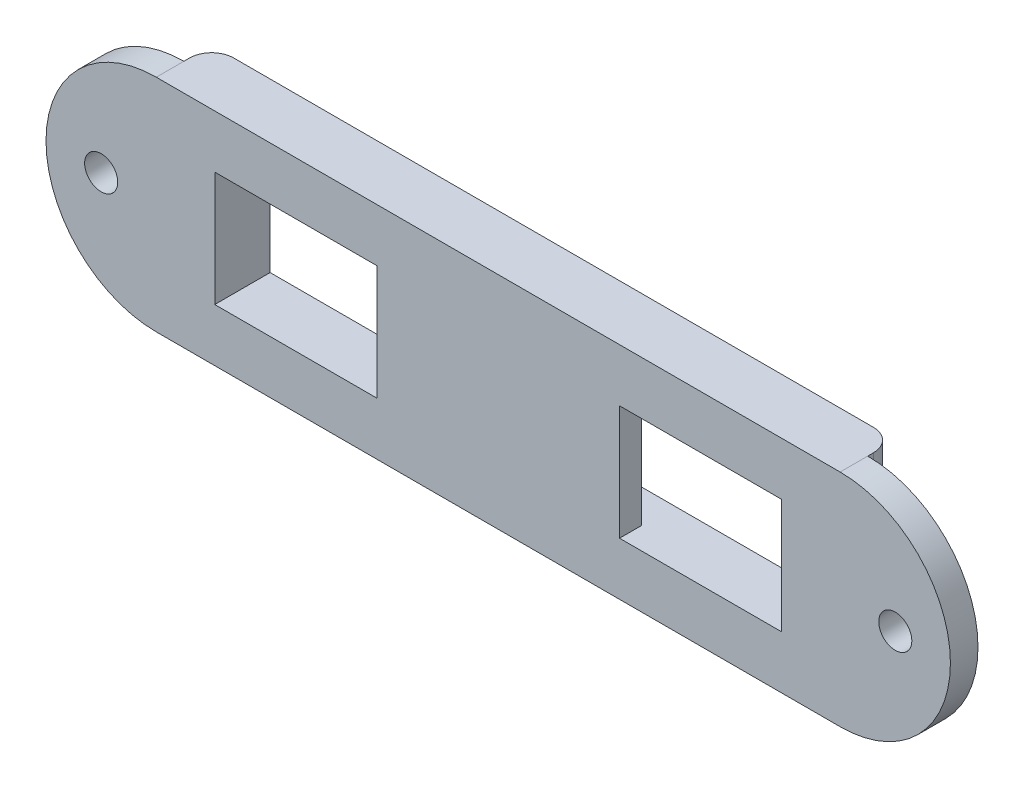
ISO-10303-21;
HEADER;
FILE_DESCRIPTION(('STEP AP214'),'2;1');
FILE_NAME('part.step','',(''),(''),'','','');
FILE_SCHEMA(('AUTOMOTIVE_DESIGN { 1 0 10303 214 1 1 1 1 }'));
ENDSEC;
DATA;
#1=APPLICATION_CONTEXT('core data for automotive mechanical design processes');
#2=APPLICATION_PROTOCOL_DEFINITION('international standard','automotive_design',2000,#1);
#3=PRODUCT_CONTEXT('',#1,'mechanical');
#4=PRODUCT('Part','Part','',(#3));
#5=PRODUCT_RELATED_PRODUCT_CATEGORY('part','',(#4));
#6=PRODUCT_DEFINITION_FORMATION('','',#4);
#7=PRODUCT_DEFINITION_CONTEXT('part definition',#1,'design');
#8=PRODUCT_DEFINITION('design','',#6,#7);
#9=PRODUCT_DEFINITION_SHAPE('','',#8);
#10=(LENGTH_UNIT() NAMED_UNIT(*) SI_UNIT(.MILLI.,.METRE.));
#11=(NAMED_UNIT(*) PLANE_ANGLE_UNIT() SI_UNIT($,.RADIAN.));
#12=(NAMED_UNIT(*) SI_UNIT($,.STERADIAN.) SOLID_ANGLE_UNIT());
#13=UNCERTAINTY_MEASURE_WITH_UNIT(LENGTH_MEASURE(1.E-05),#10,'distance_accuracy_value','');
#14=(GEOMETRIC_REPRESENTATION_CONTEXT(3) GLOBAL_UNCERTAINTY_ASSIGNED_CONTEXT((#13)) GLOBAL_UNIT_ASSIGNED_CONTEXT((#10,
#11,#12)) REPRESENTATION_CONTEXT('',''));
#15=CARTESIAN_POINT('',(0.,0.,0.));
#16=DIRECTION('',(0.,0.,1.));
#17=DIRECTION('',(1.,0.,0.));
#18=AXIS2_PLACEMENT_3D('',#15,#16,#17);
#19=CARTESIAN_POINT('',(-8.5362512379608,0.,3.02));
#20=DIRECTION('',(-1.,0.,0.));
#21=DIRECTION('',(0.,-1.,0.));
#22=AXIS2_PLACEMENT_3D('',#19,#20,#21);
#23=PLANE('',#22);
#24=DIRECTION('',(0.,0.,-1.));
#25=VECTOR('',#24,1.);
#26=CARTESIAN_POINT('',(-8.53625123796101,53.8950418755802,3.02));
#27=LINE('',#26,#25);
#28=CARTESIAN_POINT('',(-8.53625123796101,53.8950418755802,2.52));
#29=VERTEX_POINT('',#28);
#30=CARTESIAN_POINT('',(-8.53625123796101,53.8950418755802,2.));
#31=VERTEX_POINT('',#30);
#32=EDGE_CURVE('E143',#29,#31,#27,.T.);
#33=ORIENTED_EDGE('',*,*,#32,.T.);
#34=DIRECTION('',(0.,1.,0.));
#35=VECTOR('',#34,1.);
#36=CARTESIAN_POINT('',(-8.53625123796093,33.8950418755802,2.));
#37=LINE('',#36,#35);
#38=CARTESIAN_POINT('',(-8.53625123796093,33.8950418755802,2.));
#39=VERTEX_POINT('',#38);
#40=EDGE_CURVE('E42',#31,#39,#37,.F.);
#41=ORIENTED_EDGE('',*,*,#40,.T.);
#42=DIRECTION('',(0.,0.,-1.));
#43=VECTOR('',#42,1.);
#44=CARTESIAN_POINT('',(-8.53625123796093,33.8950418755802,3.02));
#45=LINE('',#44,#43);
#46=CARTESIAN_POINT('',(-8.53625123796093,33.8950418755802,2.52));
#47=VERTEX_POINT('',#46);
#48=EDGE_CURVE('E155',#47,#39,#45,.T.);
#49=ORIENTED_EDGE('',*,*,#48,.F.);
#50=DIRECTION('',(0.,-1.,0.));
#51=VECTOR('',#50,1.);
#52=CARTESIAN_POINT('',(-8.5362512379608,0.,2.52));
#53=LINE('',#52,#51);
#54=EDGE_CURVE('E153',#29,#47,#53,.T.);
#55=ORIENTED_EDGE('',*,*,#54,.F.);
#56=EDGE_LOOP('',(#33,#41,#49,#55));
#57=FACE_BOUND('',#56,.T.);
#58=ADVANCED_FACE('F34',(#57),#23,.T.);
#59=CARTESIAN_POINT('',(53.4637487620388,-1.85489640182469E-13,3.02));
#60=DIRECTION('',(1.,0.,0.));
#61=DIRECTION('',(0.,1.,0.));
#62=AXIS2_PLACEMENT_3D('',#59,#60,#61);
#63=PLANE('',#62);
#64=DIRECTION('',(0.,0.,-1.));
#65=VECTOR('',#64,1.);
#66=CARTESIAN_POINT('',(53.4637487620389,33.8950418755802,3.02));
#67=LINE('',#66,#65);
#68=CARTESIAN_POINT('',(53.4637487620389,33.8950418755802,2.52));
#69=VERTEX_POINT('',#68);
#70=CARTESIAN_POINT('',(53.4637487620389,33.8950418755802,2.));
#71=VERTEX_POINT('',#70);
#72=EDGE_CURVE('E351',#69,#71,#67,.T.);
#73=ORIENTED_EDGE('',*,*,#72,.T.);
#74=DIRECTION('',(0.,-1.,0.));
#75=VECTOR('',#74,1.);
#76=CARTESIAN_POINT('',(53.463748762039,53.8950418755802,2.));
#77=LINE('',#76,#75);
#78=CARTESIAN_POINT('',(53.463748762039,53.8950418755802,2.));
#79=VERTEX_POINT('',#78);
#80=EDGE_CURVE('E219',#71,#79,#77,.F.);
#81=ORIENTED_EDGE('',*,*,#80,.T.);
#82=DIRECTION('',(0.,0.,-1.));
#83=VECTOR('',#82,1.);
#84=CARTESIAN_POINT('',(53.463748762039,53.8950418755802,3.02));
#85=LINE('',#84,#83);
#86=CARTESIAN_POINT('',(53.463748762039,53.8950418755802,2.52));
#87=VERTEX_POINT('',#86);
#88=EDGE_CURVE('E239',#87,#79,#85,.T.);
#89=ORIENTED_EDGE('',*,*,#88,.F.);
#90=DIRECTION('',(0.,1.,0.));
#91=VECTOR('',#90,1.);
#92=CARTESIAN_POINT('',(53.4637487620388,-1.85489640182469E-13,2.52));
#93=LINE('',#92,#91);
#94=EDGE_CURVE('E316',#69,#87,#93,.T.);
#95=ORIENTED_EDGE('',*,*,#94,.F.);
#96=EDGE_LOOP('',(#73,#81,#89,#95));
#97=FACE_BOUND('',#96,.T.);
#98=ADVANCED_FACE('F253',(#97),#63,.T.);
#99=CARTESIAN_POINT('',(0.,49.0950418755802,3.02));
#100=DIRECTION('',(0.,1.,0.));
#101=DIRECTION('',(0.,0.,1.));
#102=AXIS2_PLACEMENT_3D('',#99,#100,#101);
#103=PLANE('',#102);
#104=DIRECTION('',(0.,0.,1.));
#105=VECTOR('',#104,1.);
#106=CARTESIAN_POINT('',(33.463748762039,49.0950418755802,3.02));
#107=LINE('',#106,#105);
#108=CARTESIAN_POINT('',(33.463748762039,49.0950418755802,3.02));
#109=VERTEX_POINT('',#108);
#110=CARTESIAN_POINT('',(33.463748762039,49.0950418755802,5.02));
#111=VERTEX_POINT('',#110);
#112=EDGE_CURVE('E213',#109,#111,#107,.T.);
#113=ORIENTED_EDGE('',*,*,#112,.F.);
#114=DIRECTION('',(1.,0.,0.));
#115=VECTOR('',#114,1.);
#116=CARTESIAN_POINT('',(0.,49.0950418755802,3.02));
#117=LINE('',#116,#115);
#118=CARTESIAN_POINT('',(11.463748762039,49.0950418755802,3.02));
#119=VERTEX_POINT('',#118);
#120=EDGE_CURVE('E334',#119,#109,#117,.T.);
#121=ORIENTED_EDGE('',*,*,#120,.F.);
#122=DIRECTION('',(0.,0.,1.));
#123=VECTOR('',#122,1.);
#124=CARTESIAN_POINT('',(11.463748762039,49.0950418755802,3.02));
#125=LINE('',#124,#123);
#126=CARTESIAN_POINT('',(11.463748762039,49.0950418755802,5.02));
#127=VERTEX_POINT('',#126);
#128=EDGE_CURVE('E339',#119,#127,#125,.T.);
#129=ORIENTED_EDGE('',*,*,#128,.T.);
#130=DIRECTION('',(1.,0.,0.));
#131=VECTOR('',#130,1.);
#132=CARTESIAN_POINT('',(0.,49.0950418755802,5.02));
#133=LINE('',#132,#131);
#134=CARTESIAN_POINT('',(-3.23625123796101,49.0950418755802,5.02));
#135=VERTEX_POINT('',#134);
#136=EDGE_CURVE('E201',#135,#127,#133,.T.);
#137=ORIENTED_EDGE('',*,*,#136,.F.);
#138=DIRECTION('',(0.,0.,-1.));
#139=VECTOR('',#138,1.);
#140=CARTESIAN_POINT('',(-3.23625123796101,49.0950418755802,3.02));
#141=LINE('',#140,#139);
#142=CARTESIAN_POINT('',(-3.23625123796101,49.0950418755802,0.));
#143=VERTEX_POINT('',#142);
#144=EDGE_CURVE('E177',#135,#143,#141,.T.);
#145=ORIENTED_EDGE('',*,*,#144,.T.);
#146=DIRECTION('',(1.,0.,0.));
#147=VECTOR('',#146,1.);
#148=CARTESIAN_POINT('',(0.,49.0950418755802,0.));
#149=LINE('',#148,#147);
#150=CARTESIAN_POINT('',(48.163748762039,49.0950418755802,0.));
#151=VERTEX_POINT('',#150);
#152=EDGE_CURVE('E180',#143,#151,#149,.T.);
#153=ORIENTED_EDGE('',*,*,#152,.T.);
#154=DIRECTION('',(0.,0.,-1.));
#155=VECTOR('',#154,1.);
#156=CARTESIAN_POINT('',(48.163748762039,49.0950418755802,3.02));
#157=LINE('',#156,#155);
#158=CARTESIAN_POINT('',(48.163748762039,49.0950418755802,5.02));
#159=VERTEX_POINT('',#158);
#160=EDGE_CURVE('E150',#159,#151,#157,.T.);
#161=ORIENTED_EDGE('',*,*,#160,.F.);
#162=EDGE_CURVE('E210',#111,#159,#133,.T.);
#163=ORIENTED_EDGE('',*,*,#162,.F.);
#164=EDGE_LOOP('',(#113,#121,#129,#137,#145,#153,#161,#163));
#165=FACE_BOUND('',#164,.T.);
#166=ADVANCED_FACE('F258',(#165),#103,.F.);
#167=CARTESIAN_POINT('',(0.,38.6950418755802,3.02));
#168=DIRECTION('',(0.,-1.,0.));
#169=DIRECTION('',(0.,0.,-1.));
#170=AXIS2_PLACEMENT_3D('',#167,#168,#169);
#171=PLANE('',#170);
#172=DIRECTION('',(0.,0.,-1.));
#173=VECTOR('',#172,1.);
#174=CARTESIAN_POINT('',(33.463748762039,38.6950418755802,3.02));
#175=LINE('',#174,#173);
#176=CARTESIAN_POINT('',(33.463748762039,38.6950418755802,5.02));
#177=VERTEX_POINT('',#176);
#178=CARTESIAN_POINT('',(33.463748762039,38.6950418755802,3.02));
#179=VERTEX_POINT('',#178);
#180=EDGE_CURVE('E342',#177,#179,#175,.T.);
#181=ORIENTED_EDGE('',*,*,#180,.F.);
#182=DIRECTION('',(1.,0.,0.));
#183=VECTOR('',#182,1.);
#184=CARTESIAN_POINT('',(0.,38.6950418755802,5.02));
#185=LINE('',#184,#183);
#186=CARTESIAN_POINT('',(48.163748762039,38.6950418755802,5.02));
#187=VERTEX_POINT('',#186);
#188=EDGE_CURVE('E294',#177,#187,#185,.T.);
#189=ORIENTED_EDGE('',*,*,#188,.T.);
#190=DIRECTION('',(0.,0.,-1.));
#191=VECTOR('',#190,1.);
#192=CARTESIAN_POINT('',(48.163748762039,38.6950418755802,3.02));
#193=LINE('',#192,#191);
#194=CARTESIAN_POINT('',(48.163748762039,38.6950418755802,0.));
#195=VERTEX_POINT('',#194);
#196=EDGE_CURVE('E185',#187,#195,#193,.T.);
#197=ORIENTED_EDGE('',*,*,#196,.T.);
#198=DIRECTION('',(-1.,0.,0.));
#199=VECTOR('',#198,1.);
#200=CARTESIAN_POINT('',(0.,38.6950418755802,0.));
#201=LINE('',#200,#199);
#202=CARTESIAN_POINT('',(-3.23625123796101,38.6950418755802,0.));
#203=VERTEX_POINT('',#202);
#204=EDGE_CURVE('E188',#195,#203,#201,.T.);
#205=ORIENTED_EDGE('',*,*,#204,.T.);
#206=DIRECTION('',(0.,0.,-1.));
#207=VECTOR('',#206,1.);
#208=CARTESIAN_POINT('',(-3.23625123796101,38.6950418755802,3.02));
#209=LINE('',#208,#207);
#210=CARTESIAN_POINT('',(-3.23625123796101,38.6950418755802,5.02));
#211=VERTEX_POINT('',#210);
#212=EDGE_CURVE('E181',#211,#203,#209,.T.);
#213=ORIENTED_EDGE('',*,*,#212,.F.);
#214=CARTESIAN_POINT('',(11.463748762039,38.6950418755802,5.02));
#215=VERTEX_POINT('',#214);
#216=EDGE_CURVE('E189',#211,#215,#185,.T.);
#217=ORIENTED_EDGE('',*,*,#216,.T.);
#218=DIRECTION('',(0.,0.,-1.));
#219=VECTOR('',#218,1.);
#220=CARTESIAN_POINT('',(11.463748762039,38.6950418755802,3.02));
#221=LINE('',#220,#219);
#222=CARTESIAN_POINT('',(11.463748762039,38.6950418755802,3.02));
#223=VERTEX_POINT('',#222);
#224=EDGE_CURVE('E336',#215,#223,#221,.T.);
#225=ORIENTED_EDGE('',*,*,#224,.T.);
#226=DIRECTION('',(-1.,0.,0.));
#227=VECTOR('',#226,1.);
#228=CARTESIAN_POINT('',(0.,38.6950418755802,3.02));
#229=LINE('',#228,#227);
#230=EDGE_CURVE('E329',#179,#223,#229,.T.);
#231=ORIENTED_EDGE('',*,*,#230,.F.);
#232=EDGE_LOOP('',(#181,#189,#197,#205,#213,#217,#225,#231));
#233=FACE_BOUND('',#232,.T.);
#234=ADVANCED_FACE('F277',(#233),#171,.F.);
#235=CARTESIAN_POINT('',(0.,0.,5.02));
#236=DIRECTION('',(0.,0.,1.));
#237=DIRECTION('',(1.,0.,0.));
#238=AXIS2_PLACEMENT_3D('',#235,#236,#237);
#239=PLANE('',#238);
#240=ORIENTED_EDGE('',*,*,#188,.F.);
#241=DIRECTION('',(0.,-1.,0.));
#242=VECTOR('',#241,1.);
#243=CARTESIAN_POINT('',(33.463748762039,0.,5.02));
#244=LINE('',#243,#242);
#245=EDGE_CURVE('E322',#111,#177,#244,.T.);
#246=ORIENTED_EDGE('',*,*,#245,.F.);
#247=ORIENTED_EDGE('',*,*,#162,.T.);
#248=DIRECTION('',(0.,1.,0.));
#249=VECTOR('',#248,1.);
#250=CARTESIAN_POINT('',(48.163748762039,0.,5.02));
#251=LINE('',#250,#249);
#252=EDGE_CURVE('E184',#187,#159,#251,.T.);
#253=ORIENTED_EDGE('',*,*,#252,.F.);
#254=EDGE_LOOP('',(#240,#246,#247,#253));
#255=FACE_BOUND('',#254,.T.);
#256=DIRECTION('',(0.,-1.,0.));
#257=VECTOR('',#256,1.);
#258=CARTESIAN_POINT('',(11.463748762039,0.,5.02));
#259=LINE('',#258,#257);
#260=EDGE_CURVE('E298',#127,#215,#259,.T.);
#261=ORIENTED_EDGE('',*,*,#260,.T.);
#262=ORIENTED_EDGE('',*,*,#216,.F.);
#263=DIRECTION('',(0.,-1.,0.));
#264=VECTOR('',#263,1.);
#265=CARTESIAN_POINT('',(-3.236251237961,0.,5.02));
#266=LINE('',#265,#264);
#267=EDGE_CURVE('E192',#135,#211,#266,.T.);
#268=ORIENTED_EDGE('',*,*,#267,.F.);
#269=ORIENTED_EDGE('',*,*,#136,.T.);
#270=EDGE_LOOP('',(#261,#262,#268,#269));
#271=FACE_BOUND('',#270,.T.);
#272=DIRECTION('',(-1.,0.,0.));
#273=VECTOR('',#272,1.);
#274=CARTESIAN_POINT('',(53.463748762039,53.8950418755802,5.02));
#275=LINE('',#274,#273);
#276=CARTESIAN_POINT('',(53.463748762039,53.8950418755802,5.02));
#277=VERTEX_POINT('',#276);
#278=CARTESIAN_POINT('',(-8.53625123796101,53.8950418755802,5.02));
#279=VERTEX_POINT('',#278);
#280=EDGE_CURVE('E211',#277,#279,#275,.T.);
#281=ORIENTED_EDGE('',*,*,#280,.T.);
#282=CARTESIAN_POINT('',(-8.53625123796097,43.8950418755802,5.02));
#283=DIRECTION('',(0.,0.,1.));
#284=DIRECTION('',(1.,0.,0.));
#285=AXIS2_PLACEMENT_3D('',#282,#283,#284);
#286=CIRCLE('',#285,10.);
#287=CARTESIAN_POINT('',(-8.53625123796093,33.8950418755802,5.02));
#288=VERTEX_POINT('',#287);
#289=EDGE_CURVE('E170',#288,#279,#286,.F.);
#290=ORIENTED_EDGE('',*,*,#289,.F.);
#291=DIRECTION('',(1.,0.,0.));
#292=VECTOR('',#291,1.);
#293=CARTESIAN_POINT('',(-8.53625123796093,33.8950418755802,5.02));
#294=LINE('',#293,#292);
#295=CARTESIAN_POINT('',(53.4637487620389,33.8950418755802,5.02));
#296=VERTEX_POINT('',#295);
#297=EDGE_CURVE('E207',#288,#296,#294,.T.);
#298=ORIENTED_EDGE('',*,*,#297,.T.);
#299=CARTESIAN_POINT('',(53.463748762039,43.8950418755802,5.02));
#300=DIRECTION('',(0.,0.,1.));
#301=DIRECTION('',(1.,0.,0.));
#302=AXIS2_PLACEMENT_3D('',#299,#300,#301);
#303=CIRCLE('',#302,10.);
#304=EDGE_CURVE('E317',#296,#277,#303,.T.);
#305=ORIENTED_EDGE('',*,*,#304,.T.);
#306=EDGE_LOOP('',(#281,#290,#298,#305));
#307=FACE_BOUND('',#306,.T.);
#308=CARTESIAN_POINT('',(58.463748762039,43.8950418755802,5.02));
#309=DIRECTION('',(0.,0.,1.));
#310=DIRECTION('',(1.,0.,0.));
#311=AXIS2_PLACEMENT_3D('',#308,#309,#310);
#312=CIRCLE('',#311,1.5);
#313=CARTESIAN_POINT('',(59.963748762039,43.8950418755802,5.02));
#314=VERTEX_POINT('',#313);
#315=EDGE_CURVE('E305',#314,#314,#312,.T.);
#316=ORIENTED_EDGE('',*,*,#315,.F.);
#317=EDGE_LOOP('',(#316));
#318=FACE_BOUND('',#317,.T.);
#319=CARTESIAN_POINT('',(-13.536251237961,43.8950418755802,5.02));
#320=DIRECTION('',(0.,0.,1.));
#321=DIRECTION('',(1.,0.,0.));
#322=AXIS2_PLACEMENT_3D('',#319,#320,#321);
#323=CIRCLE('',#322,1.50000000000002);
#324=CARTESIAN_POINT('',(-12.036251237961,43.8950418755802,5.02));
#325=VERTEX_POINT('',#324);
#326=EDGE_CURVE('E166',#325,#325,#323,.F.);
#327=ORIENTED_EDGE('',*,*,#326,.T.);
#328=EDGE_LOOP('',(#327));
#329=FACE_BOUND('',#328,.T.);
#330=ADVANCED_FACE('F273',(#255,#271,#307,#318,#329),#239,.T.);
#331=CARTESIAN_POINT('',(-3.236251237961,0.,3.02));
#332=DIRECTION('',(-1.,0.,0.));
#333=DIRECTION('',(0.,-1.,0.));
#334=AXIS2_PLACEMENT_3D('',#331,#332,#333);
#335=PLANE('',#334);
#336=DIRECTION('',(0.,1.,0.));
#337=VECTOR('',#336,1.);
#338=CARTESIAN_POINT('',(-3.236251237961,0.,0.));
#339=LINE('',#338,#337);
#340=EDGE_CURVE('E198',#203,#143,#339,.T.);
#341=ORIENTED_EDGE('',*,*,#340,.T.);
#342=ORIENTED_EDGE('',*,*,#144,.F.);
#343=ORIENTED_EDGE('',*,*,#267,.T.);
#344=ORIENTED_EDGE('',*,*,#212,.T.);
#345=EDGE_LOOP('',(#341,#342,#343,#344));
#346=FACE_BOUND('',#345,.T.);
#347=ADVANCED_FACE('F270',(#346),#335,.F.);
#348=CARTESIAN_POINT('',(48.163748762039,0.,3.02));
#349=DIRECTION('',(1.,0.,0.));
#350=DIRECTION('',(0.,0.,-1.));
#351=AXIS2_PLACEMENT_3D('',#348,#349,#350);
#352=PLANE('',#351);
#353=DIRECTION('',(0.,-1.,0.));
#354=VECTOR('',#353,1.);
#355=CARTESIAN_POINT('',(48.163748762039,0.,0.));
#356=LINE('',#355,#354);
#357=EDGE_CURVE('E195',#151,#195,#356,.T.);
#358=ORIENTED_EDGE('',*,*,#357,.T.);
#359=ORIENTED_EDGE('',*,*,#196,.F.);
#360=ORIENTED_EDGE('',*,*,#252,.T.);
#361=ORIENTED_EDGE('',*,*,#160,.T.);
#362=EDGE_LOOP('',(#358,#359,#360,#361));
#363=FACE_BOUND('',#362,.T.);
#364=ADVANCED_FACE('F266',(#363),#352,.F.);
#365=CARTESIAN_POINT('',(0.,33.8950418755802,3.02));
#366=DIRECTION('',(0.,-1.,0.));
#367=DIRECTION('',(1.,0.,0.));
#368=AXIS2_PLACEMENT_3D('',#365,#366,#367);
#369=PLANE('',#368);
#370=ORIENTED_EDGE('',*,*,#48,.T.);
#371=CARTESIAN_POINT('',(-6.53625123796093,33.8950418755802,2.));
#372=DIRECTION('',(0.,-1.,0.));
#373=DIRECTION('',(1.,0.,0.));
#374=AXIS2_PLACEMENT_3D('',#371,#372,#373);
#375=CIRCLE('',#374,2.);
#376=CARTESIAN_POINT('',(-6.53625123796093,33.8950418755802,0.));
#377=VERTEX_POINT('',#376);
#378=EDGE_CURVE('E11',#39,#377,#375,.T.);
#379=ORIENTED_EDGE('',*,*,#378,.T.);
#380=DIRECTION('',(-1.,0.,0.));
#381=VECTOR('',#380,1.);
#382=CARTESIAN_POINT('',(0.,33.8950418755802,0.));
#383=LINE('',#382,#381);
#384=CARTESIAN_POINT('',(51.4637487620389,33.8950418755802,0.));
#385=VERTEX_POINT('',#384);
#386=EDGE_CURVE('E203',#385,#377,#383,.T.);
#387=ORIENTED_EDGE('',*,*,#386,.F.);
#388=CARTESIAN_POINT('',(51.4637487620389,33.8950418755802,2.));
#389=DIRECTION('',(0.,-1.,0.));
#390=DIRECTION('',(1.,0.,0.));
#391=AXIS2_PLACEMENT_3D('',#388,#389,#390);
#392=CIRCLE('',#391,2.);
#393=EDGE_CURVE('E217',#385,#71,#392,.T.);
#394=ORIENTED_EDGE('',*,*,#393,.T.);
#395=ORIENTED_EDGE('',*,*,#72,.F.);
#396=EDGE_CURVE('E352',#296,#69,#67,.T.);
#397=ORIENTED_EDGE('',*,*,#396,.F.);
#398=ORIENTED_EDGE('',*,*,#297,.F.);
#399=EDGE_CURVE('E171',#288,#47,#45,.T.);
#400=ORIENTED_EDGE('',*,*,#399,.T.);
#401=EDGE_LOOP('',(#370,#379,#387,#394,#395,#397,#398,#400));
#402=FACE_BOUND('',#401,.T.);
#403=ADVANCED_FACE('F244',(#402),#369,.T.);
#404=CARTESIAN_POINT('',(0.,53.8950418755802,3.02));
#405=DIRECTION('',(0.,1.,0.));
#406=DIRECTION('',(-1.,0.,0.));
#407=AXIS2_PLACEMENT_3D('',#404,#405,#406);
#408=PLANE('',#407);
#409=DIRECTION('',(1.,0.,0.));
#410=VECTOR('',#409,1.);
#411=CARTESIAN_POINT('',(0.,53.8950418755802,0.));
#412=LINE('',#411,#410);
#413=CARTESIAN_POINT('',(-6.53625123796101,53.8950418755802,0.));
#414=VERTEX_POINT('',#413);
#415=CARTESIAN_POINT('',(51.463748762039,53.8950418755802,0.));
#416=VERTEX_POINT('',#415);
#417=EDGE_CURVE('E194',#414,#416,#412,.T.);
#418=ORIENTED_EDGE('',*,*,#417,.F.);
#419=CARTESIAN_POINT('',(-6.53625123796101,53.8950418755802,2.));
#420=DIRECTION('',(0.,1.,0.));
#421=DIRECTION('',(-1.,0.,0.));
#422=AXIS2_PLACEMENT_3D('',#419,#420,#421);
#423=CIRCLE('',#422,2.);
#424=EDGE_CURVE('E56',#414,#31,#423,.T.);
#425=ORIENTED_EDGE('',*,*,#424,.T.);
#426=ORIENTED_EDGE('',*,*,#32,.F.);
#427=EDGE_CURVE('E148',#279,#29,#27,.T.);
#428=ORIENTED_EDGE('',*,*,#427,.F.);
#429=ORIENTED_EDGE('',*,*,#280,.F.);
#430=EDGE_CURVE('E175',#277,#87,#85,.T.);
#431=ORIENTED_EDGE('',*,*,#430,.T.);
#432=ORIENTED_EDGE('',*,*,#88,.T.);
#433=CARTESIAN_POINT('',(51.463748762039,53.8950418755802,2.));
#434=DIRECTION('',(0.,1.,0.));
#435=DIRECTION('',(-1.,0.,0.));
#436=AXIS2_PLACEMENT_3D('',#433,#434,#435);
#437=CIRCLE('',#436,2.);
#438=EDGE_CURVE('E221',#79,#416,#437,.T.);
#439=ORIENTED_EDGE('',*,*,#438,.T.);
#440=EDGE_LOOP('',(#418,#425,#426,#428,#429,#431,#432,#439));
#441=FACE_BOUND('',#440,.T.);
#442=ADVANCED_FACE('F145',(#441),#408,.T.);
#443=CARTESIAN_POINT('',(0.,0.,0.));
#444=DIRECTION('',(0.,0.,1.));
#445=DIRECTION('',(1.,0.,0.));
#446=AXIS2_PLACEMENT_3D('',#443,#444,#445);
#447=PLANE('',#446);
#448=ORIENTED_EDGE('',*,*,#386,.T.);
#449=DIRECTION('',(0.,1.,0.));
#450=VECTOR('',#449,1.);
#451=CARTESIAN_POINT('',(-6.53625123796101,53.8950418755802,0.));
#452=LINE('',#451,#450);
#453=EDGE_CURVE('E224',#377,#414,#452,.T.);
#454=ORIENTED_EDGE('',*,*,#453,.T.);
#455=ORIENTED_EDGE('',*,*,#417,.T.);
#456=DIRECTION('',(0.,-1.,0.));
#457=VECTOR('',#456,1.);
#458=CARTESIAN_POINT('',(51.4637487620389,33.8950418755802,0.));
#459=LINE('',#458,#457);
#460=EDGE_CURVE('E206',#416,#385,#459,.T.);
#461=ORIENTED_EDGE('',*,*,#460,.T.);
#462=EDGE_LOOP('',(#448,#454,#455,#461));
#463=FACE_BOUND('',#462,.T.);
#464=ORIENTED_EDGE('',*,*,#340,.F.);
#465=ORIENTED_EDGE('',*,*,#204,.F.);
#466=ORIENTED_EDGE('',*,*,#357,.F.);
#467=ORIENTED_EDGE('',*,*,#152,.F.);
#468=EDGE_LOOP('',(#464,#465,#466,#467));
#469=FACE_BOUND('',#468,.T.);
#470=ADVANCED_FACE('F229',(#463,#469),#447,.F.);
#471=CARTESIAN_POINT('',(33.463748762039,0.,3.02));
#472=DIRECTION('',(-1.,0.,0.));
#473=DIRECTION('',(0.,0.,1.));
#474=AXIS2_PLACEMENT_3D('',#471,#472,#473);
#475=PLANE('',#474);
#476=ORIENTED_EDGE('',*,*,#245,.T.);
#477=ORIENTED_EDGE('',*,*,#180,.T.);
#478=DIRECTION('',(0.,-1.,0.));
#479=VECTOR('',#478,1.);
#480=CARTESIAN_POINT('',(33.463748762039,0.,3.02));
#481=LINE('',#480,#479);
#482=EDGE_CURVE('E325',#109,#179,#481,.T.);
#483=ORIENTED_EDGE('',*,*,#482,.F.);
#484=ORIENTED_EDGE('',*,*,#112,.T.);
#485=EDGE_LOOP('',(#476,#477,#483,#484));
#486=FACE_BOUND('',#485,.T.);
#487=ADVANCED_FACE('F263',(#486),#475,.F.);
#488=CARTESIAN_POINT('',(11.463748762039,0.,3.02));
#489=DIRECTION('',(-1.,0.,0.));
#490=DIRECTION('',(0.,0.,1.));
#491=AXIS2_PLACEMENT_3D('',#488,#489,#490);
#492=PLANE('',#491);
#493=DIRECTION('',(0.,-1.,0.));
#494=VECTOR('',#493,1.);
#495=CARTESIAN_POINT('',(11.463748762039,0.,3.02));
#496=LINE('',#495,#494);
#497=EDGE_CURVE('E327',#119,#223,#496,.T.);
#498=ORIENTED_EDGE('',*,*,#497,.T.);
#499=ORIENTED_EDGE('',*,*,#224,.F.);
#500=ORIENTED_EDGE('',*,*,#260,.F.);
#501=ORIENTED_EDGE('',*,*,#128,.F.);
#502=EDGE_LOOP('',(#498,#499,#500,#501));
#503=FACE_BOUND('',#502,.T.);
#504=ADVANCED_FACE('F370',(#503),#492,.T.);
#505=CARTESIAN_POINT('',(0.,0.,3.02));
#506=DIRECTION('',(0.,0.,1.));
#507=DIRECTION('',(1.,0.,0.));
#508=AXIS2_PLACEMENT_3D('',#505,#506,#507);
#509=PLANE('',#508);
#510=ORIENTED_EDGE('',*,*,#482,.T.);
#511=ORIENTED_EDGE('',*,*,#230,.T.);
#512=ORIENTED_EDGE('',*,*,#497,.F.);
#513=ORIENTED_EDGE('',*,*,#120,.T.);
#514=EDGE_LOOP('',(#510,#511,#512,#513));
#515=FACE_BOUND('',#514,.T.);
#516=ADVANCED_FACE('F374',(#515),#509,.F.);
#517=CARTESIAN_POINT('',(58.463748762039,43.8950418755802,2.52));
#518=DIRECTION('',(0.,0.,1.));
#519=DIRECTION('',(1.,0.,0.));
#520=AXIS2_PLACEMENT_3D('',#517,#518,#519);
#521=CYLINDRICAL_SURFACE('',#520,1.5);
#522=CARTESIAN_POINT('',(58.463748762039,43.8950418755802,2.52));
#523=DIRECTION('',(0.,0.,1.));
#524=DIRECTION('',(1.,0.,0.));
#525=AXIS2_PLACEMENT_3D('',#522,#523,#524);
#526=CIRCLE('',#525,1.5);
#527=CARTESIAN_POINT('',(59.963748762039,43.8950418755802,2.52));
#528=VERTEX_POINT('',#527);
#529=EDGE_CURVE('E313',#528,#528,#526,.T.);
#530=ORIENTED_EDGE('',*,*,#529,.F.);
#531=EDGE_LOOP('',(#530));
#532=FACE_BOUND('',#531,.T.);
#533=ORIENTED_EDGE('',*,*,#315,.T.);
#534=EDGE_LOOP('',(#533));
#535=FACE_BOUND('',#534,.T.);
#536=ADVANCED_FACE('F383',(#532,#535),#521,.F.);
#537=CARTESIAN_POINT('',(53.463748762039,43.8950418755802,2.52));
#538=DIRECTION('',(0.,0.,1.));
#539=DIRECTION('',(1.,0.,0.));
#540=AXIS2_PLACEMENT_3D('',#537,#538,#539);
#541=CYLINDRICAL_SURFACE('',#540,10.);
#542=ORIENTED_EDGE('',*,*,#304,.F.);
#543=ORIENTED_EDGE('',*,*,#396,.T.);
#544=CARTESIAN_POINT('',(53.463748762039,43.8950418755802,2.52));
#545=DIRECTION('',(0.,0.,1.));
#546=DIRECTION('',(1.,0.,0.));
#547=AXIS2_PLACEMENT_3D('',#544,#545,#546);
#548=CIRCLE('',#547,10.);
#549=EDGE_CURVE('E320',#69,#87,#548,.T.);
#550=ORIENTED_EDGE('',*,*,#549,.T.);
#551=ORIENTED_EDGE('',*,*,#430,.F.);
#552=EDGE_LOOP('',(#542,#543,#550,#551));
#553=FACE_BOUND('',#552,.T.);
#554=ADVANCED_FACE('F388',(#553),#541,.T.);
#555=CARTESIAN_POINT('',(0.,0.,2.52));
#556=DIRECTION('',(0.,0.,1.));
#557=DIRECTION('',(1.,0.,0.));
#558=AXIS2_PLACEMENT_3D('',#555,#556,#557);
#559=PLANE('',#558);
#560=ORIENTED_EDGE('',*,*,#529,.T.);
#561=EDGE_LOOP('',(#560));
#562=FACE_BOUND('',#561,.T.);
#563=ORIENTED_EDGE('',*,*,#94,.T.);
#564=ORIENTED_EDGE('',*,*,#549,.F.);
#565=EDGE_LOOP('',(#563,#564));
#566=FACE_BOUND('',#565,.T.);
#567=ADVANCED_FACE('F392',(#562,#566),#559,.F.);
#568=CARTESIAN_POINT('',(-8.53625123796097,43.8950418755802,2.52));
#569=DIRECTION('',(0.,0.,1.));
#570=DIRECTION('',(1.,0.,0.));
#571=AXIS2_PLACEMENT_3D('',#568,#569,#570);
#572=CYLINDRICAL_SURFACE('',#571,10.);
#573=ORIENTED_EDGE('',*,*,#289,.T.);
#574=ORIENTED_EDGE('',*,*,#427,.T.);
#575=CARTESIAN_POINT('',(-8.53625123796097,43.8950418755802,2.52));
#576=DIRECTION('',(0.,0.,1.));
#577=DIRECTION('',(1.,0.,0.));
#578=AXIS2_PLACEMENT_3D('',#575,#576,#577);
#579=CIRCLE('',#578,10.);
#580=EDGE_CURVE('E160',#47,#29,#579,.F.);
#581=ORIENTED_EDGE('',*,*,#580,.F.);
#582=ORIENTED_EDGE('',*,*,#399,.F.);
#583=EDGE_LOOP('',(#573,#574,#581,#582));
#584=FACE_BOUND('',#583,.T.);
#585=ADVANCED_FACE('F168',(#584),#572,.T.);
#586=CARTESIAN_POINT('',(-13.536251237961,43.8950418755802,2.52));
#587=DIRECTION('',(0.,0.,1.));
#588=DIRECTION('',(1.,0.,0.));
#589=AXIS2_PLACEMENT_3D('',#586,#587,#588);
#590=CYLINDRICAL_SURFACE('',#589,1.50000000000002);
#591=CARTESIAN_POINT('',(-13.536251237961,43.8950418755802,2.52));
#592=DIRECTION('',(0.,0.,1.));
#593=DIRECTION('',(1.,0.,0.));
#594=AXIS2_PLACEMENT_3D('',#591,#592,#593);
#595=CIRCLE('',#594,1.50000000000002);
#596=CARTESIAN_POINT('',(-12.036251237961,43.8950418755802,2.52));
#597=VERTEX_POINT('',#596);
#598=EDGE_CURVE('E159',#597,#597,#595,.F.);
#599=ORIENTED_EDGE('',*,*,#598,.T.);
#600=EDGE_LOOP('',(#599));
#601=FACE_BOUND('',#600,.T.);
#602=ORIENTED_EDGE('',*,*,#326,.F.);
#603=EDGE_LOOP('',(#602));
#604=FACE_BOUND('',#603,.T.);
#605=ADVANCED_FACE('F398',(#601,#604),#590,.F.);
#606=CARTESIAN_POINT('',(0.,0.,2.52));
#607=DIRECTION('',(0.,0.,1.));
#608=DIRECTION('',(1.,0.,0.));
#609=AXIS2_PLACEMENT_3D('',#606,#607,#608);
#610=PLANE('',#609);
#611=ORIENTED_EDGE('',*,*,#580,.T.);
#612=ORIENTED_EDGE('',*,*,#54,.T.);
#613=EDGE_LOOP('',(#611,#612));
#614=FACE_BOUND('',#613,.T.);
#615=ORIENTED_EDGE('',*,*,#598,.F.);
#616=EDGE_LOOP('',(#615));
#617=FACE_BOUND('',#616,.T.);
#618=ADVANCED_FACE('F162',(#614,#617),#610,.F.);
#619=CARTESIAN_POINT('',(51.4637487620388,-1.78550746278562E-13,2.));
#620=DIRECTION('',(0.,1.,0.));
#621=DIRECTION('',(-1.,0.,0.));
#622=AXIS2_PLACEMENT_3D('',#619,#620,#621);
#623=CYLINDRICAL_SURFACE('',#622,2.);
#624=ORIENTED_EDGE('',*,*,#438,.F.);
#625=ORIENTED_EDGE('',*,*,#80,.F.);
#626=ORIENTED_EDGE('',*,*,#393,.F.);
#627=ORIENTED_EDGE('',*,*,#460,.F.);
#628=EDGE_LOOP('',(#624,#625,#626,#627));
#629=FACE_BOUND('',#628,.T.);
#630=ADVANCED_FACE('F242',(#629),#623,.T.);
#631=CARTESIAN_POINT('',(-6.5362512379608,0.,2.));
#632=DIRECTION('',(0.,-1.,0.));
#633=DIRECTION('',(1.,0.,0.));
#634=AXIS2_PLACEMENT_3D('',#631,#632,#633);
#635=CYLINDRICAL_SURFACE('',#634,2.);
#636=ORIENTED_EDGE('',*,*,#378,.F.);
#637=ORIENTED_EDGE('',*,*,#40,.F.);
#638=ORIENTED_EDGE('',*,*,#424,.F.);
#639=ORIENTED_EDGE('',*,*,#453,.F.);
#640=EDGE_LOOP('',(#636,#637,#638,#639));
#641=FACE_BOUND('',#640,.T.);
#642=ADVANCED_FACE('F36',(#641),#635,.T.);
#643=CLOSED_SHELL('',(#58,#98,#166,#234,#330,#347,#364,#403,#442,#470,#487,#504,#516,#536,#554,
#567,#585,#605,#618,#630,#642));
#644=MANIFOLD_SOLID_BREP('B2',#643);
#645=ADVANCED_BREP_SHAPE_REPRESENTATION('',(#18,#644),#14);
#646=SHAPE_DEFINITION_REPRESENTATION(#9,#645);
ENDSEC;
END-ISO-10303-21;
